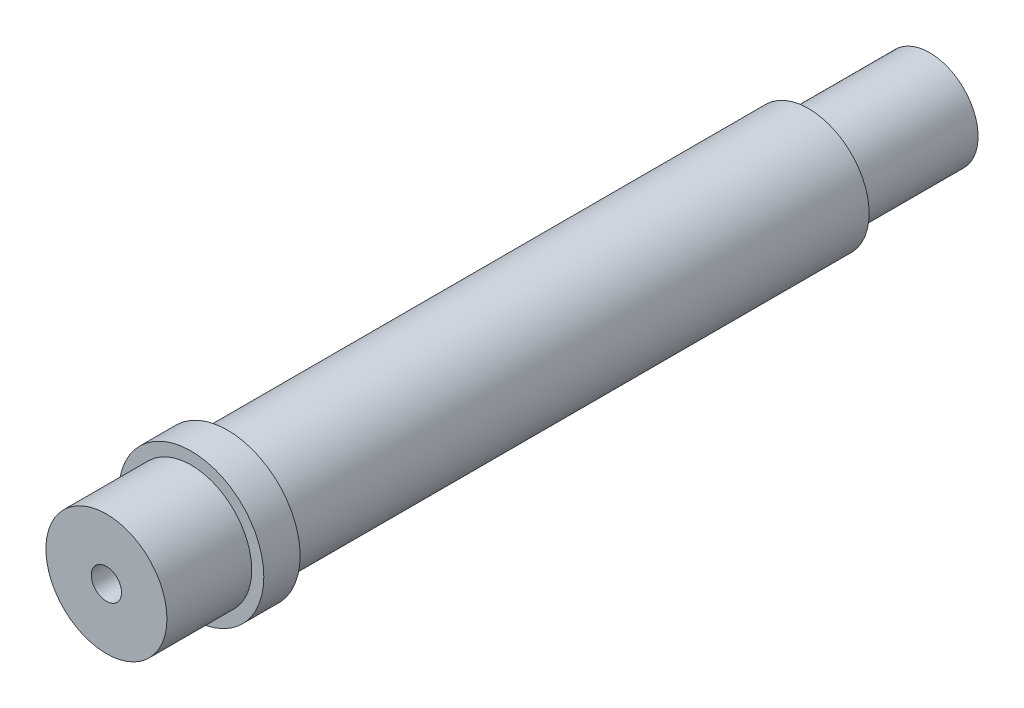
ISO-10303-21;
HEADER;
FILE_DESCRIPTION(('STEP AP214'),'2;1');
FILE_NAME('part.step','',(''),(''),'','','');
FILE_SCHEMA(('AUTOMOTIVE_DESIGN { 1 0 10303 214 1 1 1 1 }'));
ENDSEC;
DATA;
#1=APPLICATION_CONTEXT('core data for automotive mechanical design processes');
#2=APPLICATION_PROTOCOL_DEFINITION('international standard','automotive_design',2000,#1);
#3=PRODUCT_CONTEXT('',#1,'mechanical');
#4=PRODUCT('Part','Part','',(#3));
#5=PRODUCT_RELATED_PRODUCT_CATEGORY('part','',(#4));
#6=PRODUCT_DEFINITION_FORMATION('','',#4);
#7=PRODUCT_DEFINITION_CONTEXT('part definition',#1,'design');
#8=PRODUCT_DEFINITION('design','',#6,#7);
#9=PRODUCT_DEFINITION_SHAPE('','',#8);
#10=(LENGTH_UNIT() NAMED_UNIT(*) SI_UNIT(.MILLI.,.METRE.));
#11=(NAMED_UNIT(*) PLANE_ANGLE_UNIT() SI_UNIT($,.RADIAN.));
#12=(NAMED_UNIT(*) SI_UNIT($,.STERADIAN.) SOLID_ANGLE_UNIT());
#13=UNCERTAINTY_MEASURE_WITH_UNIT(LENGTH_MEASURE(1.E-05),#10,'distance_accuracy_value','');
#14=(GEOMETRIC_REPRESENTATION_CONTEXT(3) GLOBAL_UNCERTAINTY_ASSIGNED_CONTEXT((#13)) GLOBAL_UNIT_ASSIGNED_CONTEXT((#10,
#11,#12)) REPRESENTATION_CONTEXT('',''));
#15=CARTESIAN_POINT('',(0.,0.,0.));
#16=DIRECTION('',(0.,0.,1.));
#17=DIRECTION('',(1.,0.,0.));
#18=AXIS2_PLACEMENT_3D('',#15,#16,#17);
#19=CARTESIAN_POINT('',(0.,0.,48.));
#20=DIRECTION('',(0.,0.,-1.));
#21=DIRECTION('',(-1.,0.,0.));
#22=AXIS2_PLACEMENT_3D('',#19,#20,#21);
#23=CYLINDRICAL_SURFACE('',#22,5.);
#24=CARTESIAN_POINT('',(0.,0.,48.));
#25=DIRECTION('',(0.,0.,1.));
#26=DIRECTION('',(1.,0.,0.));
#27=AXIS2_PLACEMENT_3D('',#24,#25,#26);
#28=CIRCLE('',#27,5.);
#29=CARTESIAN_POINT('',(5.,0.,48.));
#30=VERTEX_POINT('',#29);
#31=EDGE_CURVE('E48',#30,#30,#28,.T.);
#32=ORIENTED_EDGE('',*,*,#31,.F.);
#33=EDGE_LOOP('',(#32));
#34=FACE_BOUND('',#33,.T.);
#35=CARTESIAN_POINT('',(0.,0.,0.));
#36=DIRECTION('',(0.,0.,1.));
#37=DIRECTION('',(1.,0.,0.));
#38=AXIS2_PLACEMENT_3D('',#35,#36,#37);
#39=CIRCLE('',#38,5.);
#40=CARTESIAN_POINT('',(5.,0.,0.));
#41=VERTEX_POINT('',#40);
#42=EDGE_CURVE('E39',#41,#41,#39,.T.);
#43=ORIENTED_EDGE('',*,*,#42,.T.);
#44=EDGE_LOOP('',(#43));
#45=FACE_BOUND('',#44,.T.);
#46=ADVANCED_FACE('F36',(#34,#45),#23,.T.);
#47=CARTESIAN_POINT('',(0.,0.,0.));
#48=DIRECTION('',(0.,0.,1.));
#49=DIRECTION('',(1.,0.,0.));
#50=AXIS2_PLACEMENT_3D('',#47,#48,#49);
#51=PLANE('',#50);
#52=CARTESIAN_POINT('',(0.,0.,0.));
#53=DIRECTION('',(0.,0.,-1.));
#54=DIRECTION('',(-1.,0.,0.));
#55=AXIS2_PLACEMENT_3D('',#52,#53,#54);
#56=CIRCLE('',#55,4.);
#57=CARTESIAN_POINT('',(-4.,0.,0.));
#58=VERTEX_POINT('',#57);
#59=EDGE_CURVE('E10',#58,#58,#56,.T.);
#60=ORIENTED_EDGE('',*,*,#59,.F.);
#61=EDGE_LOOP('',(#60));
#62=FACE_BOUND('',#61,.T.);
#63=ORIENTED_EDGE('',*,*,#42,.F.);
#64=EDGE_LOOP('',(#63));
#65=FACE_BOUND('',#64,.T.);
#66=ADVANCED_FACE('F69',(#62,#65),#51,.F.);
#67=CARTESIAN_POINT('',(0.,0.,51.));
#68=DIRECTION('',(0.,0.,-1.));
#69=DIRECTION('',(-1.,0.,0.));
#70=AXIS2_PLACEMENT_3D('',#67,#68,#69);
#71=CYLINDRICAL_SURFACE('',#70,6.);
#72=CARTESIAN_POINT('',(0.,0.,51.));
#73=DIRECTION('',(0.,0.,1.));
#74=DIRECTION('',(1.,0.,0.));
#75=AXIS2_PLACEMENT_3D('',#72,#73,#74);
#76=CIRCLE('',#75,6.);
#77=CARTESIAN_POINT('',(6.,0.,51.));
#78=VERTEX_POINT('',#77);
#79=EDGE_CURVE('E58',#78,#78,#76,.T.);
#80=ORIENTED_EDGE('',*,*,#79,.F.);
#81=EDGE_LOOP('',(#80));
#82=FACE_BOUND('',#81,.T.);
#83=CARTESIAN_POINT('',(0.,0.,48.));
#84=DIRECTION('',(0.,0.,1.));
#85=DIRECTION('',(1.,0.,0.));
#86=AXIS2_PLACEMENT_3D('',#83,#84,#85);
#87=CIRCLE('',#86,6.);
#88=CARTESIAN_POINT('',(6.,0.,48.));
#89=VERTEX_POINT('',#88);
#90=EDGE_CURVE('E56',#89,#89,#87,.T.);
#91=ORIENTED_EDGE('',*,*,#90,.T.);
#92=EDGE_LOOP('',(#91));
#93=FACE_BOUND('',#92,.T.);
#94=ADVANCED_FACE('F71',(#82,#93),#71,.T.);
#95=CARTESIAN_POINT('',(0.,0.,51.));
#96=DIRECTION('',(0.,0.,1.));
#97=DIRECTION('',(1.,0.,0.));
#98=AXIS2_PLACEMENT_3D('',#95,#96,#97);
#99=PLANE('',#98);
#100=CARTESIAN_POINT('',(0.,0.,51.));
#101=DIRECTION('',(0.,0.,1.));
#102=DIRECTION('',(1.,0.,0.));
#103=AXIS2_PLACEMENT_3D('',#100,#101,#102);
#104=CIRCLE('',#103,5.);
#105=CARTESIAN_POINT('',(5.,0.,51.));
#106=VERTEX_POINT('',#105);
#107=EDGE_CURVE('E43',#106,#106,#104,.T.);
#108=ORIENTED_EDGE('',*,*,#107,.F.);
#109=EDGE_LOOP('',(#108));
#110=FACE_BOUND('',#109,.T.);
#111=ORIENTED_EDGE('',*,*,#79,.T.);
#112=EDGE_LOOP('',(#111));
#113=FACE_BOUND('',#112,.T.);
#114=ADVANCED_FACE('F77',(#110,#113),#99,.T.);
#115=CARTESIAN_POINT('',(0.,0.,48.));
#116=DIRECTION('',(0.,0.,1.));
#117=DIRECTION('',(1.,0.,0.));
#118=AXIS2_PLACEMENT_3D('',#115,#116,#117);
#119=PLANE('',#118);
#120=ORIENTED_EDGE('',*,*,#31,.T.);
#121=EDGE_LOOP('',(#120));
#122=FACE_BOUND('',#121,.T.);
#123=ORIENTED_EDGE('',*,*,#90,.F.);
#124=EDGE_LOOP('',(#123));
#125=FACE_BOUND('',#124,.T.);
#126=ADVANCED_FACE('F82',(#122,#125),#119,.F.);
#127=CARTESIAN_POINT('',(0.,0.,58.));
#128=DIRECTION('',(0.,0.,-1.));
#129=DIRECTION('',(-1.,0.,0.));
#130=AXIS2_PLACEMENT_3D('',#127,#128,#129);
#131=CYLINDRICAL_SURFACE('',#130,5.);
#132=CARTESIAN_POINT('',(0.,0.,58.));
#133=DIRECTION('',(0.,0.,1.));
#134=DIRECTION('',(1.,0.,0.));
#135=AXIS2_PLACEMENT_3D('',#132,#133,#134);
#136=CIRCLE('',#135,5.);
#137=CARTESIAN_POINT('',(5.,0.,58.));
#138=VERTEX_POINT('',#137);
#139=EDGE_CURVE('E54',#138,#138,#136,.T.);
#140=ORIENTED_EDGE('',*,*,#139,.F.);
#141=EDGE_LOOP('',(#140));
#142=FACE_BOUND('',#141,.T.);
#143=ORIENTED_EDGE('',*,*,#107,.T.);
#144=EDGE_LOOP('',(#143));
#145=FACE_BOUND('',#144,.T.);
#146=ADVANCED_FACE('F85',(#142,#145),#131,.T.);
#147=CARTESIAN_POINT('',(0.,0.,58.));
#148=DIRECTION('',(0.,0.,1.));
#149=DIRECTION('',(1.,0.,0.));
#150=AXIS2_PLACEMENT_3D('',#147,#148,#149);
#151=PLANE('',#150);
#152=CARTESIAN_POINT('',(0.,0.,58.));
#153=DIRECTION('',(0.,0.,1.));
#154=DIRECTION('',(1.,0.,0.));
#155=AXIS2_PLACEMENT_3D('',#152,#153,#154);
#156=CIRCLE('',#155,1.25);
#157=CARTESIAN_POINT('',(1.25,0.,58.));
#158=VERTEX_POINT('',#157);
#159=EDGE_CURVE('E124',#158,#158,#156,.T.);
#160=ORIENTED_EDGE('',*,*,#159,.F.);
#161=EDGE_LOOP('',(#160));
#162=FACE_BOUND('',#161,.T.);
#163=ORIENTED_EDGE('',*,*,#139,.T.);
#164=EDGE_LOOP('',(#163));
#165=FACE_BOUND('',#164,.T.);
#166=ADVANCED_FACE('F91',(#162,#165),#151,.T.);
#167=CARTESIAN_POINT('',(0.,0.,-10.));
#168=DIRECTION('',(0.,0.,1.));
#169=DIRECTION('',(1.,0.,0.));
#170=AXIS2_PLACEMENT_3D('',#167,#168,#169);
#171=CYLINDRICAL_SURFACE('',#170,4.);
#172=CARTESIAN_POINT('',(0.,0.,-10.));
#173=DIRECTION('',(0.,0.,-1.));
#174=DIRECTION('',(-1.,0.,0.));
#175=AXIS2_PLACEMENT_3D('',#172,#173,#174);
#176=CIRCLE('',#175,4.);
#177=CARTESIAN_POINT('',(-4.,0.,-10.));
#178=VERTEX_POINT('',#177);
#179=EDGE_CURVE('E52',#178,#178,#176,.T.);
#180=ORIENTED_EDGE('',*,*,#179,.F.);
#181=EDGE_LOOP('',(#180));
#182=FACE_BOUND('',#181,.T.);
#183=ORIENTED_EDGE('',*,*,#59,.T.);
#184=EDGE_LOOP('',(#183));
#185=FACE_BOUND('',#184,.T.);
#186=ADVANCED_FACE('F95',(#182,#185),#171,.T.);
#187=CARTESIAN_POINT('',(0.,0.,-10.));
#188=DIRECTION('',(0.,0.,-1.));
#189=DIRECTION('',(-1.,0.,0.));
#190=AXIS2_PLACEMENT_3D('',#187,#188,#189);
#191=PLANE('',#190);
#192=CARTESIAN_POINT('',(0.,0.,-10.));
#193=DIRECTION('',(0.,0.,-1.));
#194=DIRECTION('',(-1.,0.,0.));
#195=AXIS2_PLACEMENT_3D('',#192,#193,#194);
#196=CIRCLE('',#195,1.25);
#197=CARTESIAN_POINT('',(-1.25,0.,-10.));
#198=VERTEX_POINT('',#197);
#199=EDGE_CURVE('E125',#198,#198,#196,.T.);
#200=ORIENTED_EDGE('',*,*,#199,.F.);
#201=EDGE_LOOP('',(#200));
#202=FACE_BOUND('',#201,.T.);
#203=ORIENTED_EDGE('',*,*,#179,.T.);
#204=EDGE_LOOP('',(#203));
#205=FACE_BOUND('',#204,.T.);
#206=ADVANCED_FACE('F99',(#202,#205),#191,.T.);
#207=CARTESIAN_POINT('',(0.,0.,48.));
#208=DIRECTION('',(0.,0.,1.));
#209=DIRECTION('',(1.,0.,0.));
#210=AXIS2_PLACEMENT_3D('',#207,#208,#209);
#211=CYLINDRICAL_SURFACE('',#210,1.25);
#212=CARTESIAN_POINT('',(0.,0.,48.));
#213=DIRECTION('',(0.,0.,1.));
#214=DIRECTION('',(1.,0.,0.));
#215=AXIS2_PLACEMENT_3D('',#212,#213,#214);
#216=CIRCLE('',#215,1.25);
#217=CARTESIAN_POINT('',(1.25,0.,48.));
#218=VERTEX_POINT('',#217);
#219=EDGE_CURVE('E128',#218,#218,#216,.T.);
#220=ORIENTED_EDGE('',*,*,#219,.F.);
#221=EDGE_LOOP('',(#220));
#222=FACE_BOUND('',#221,.T.);
#223=ORIENTED_EDGE('',*,*,#159,.T.);
#224=EDGE_LOOP('',(#223));
#225=FACE_BOUND('',#224,.T.);
#226=ADVANCED_FACE('F103',(#222,#225),#211,.F.);
#227=CARTESIAN_POINT('',(0.,0.,48.));
#228=DIRECTION('',(0.,0.,1.));
#229=DIRECTION('',(1.,0.,0.));
#230=AXIS2_PLACEMENT_3D('',#227,#228,#229);
#231=PLANE('',#230);
#232=ORIENTED_EDGE('',*,*,#219,.T.);
#233=EDGE_LOOP('',(#232));
#234=FACE_BOUND('',#233,.T.);
#235=ADVANCED_FACE('F107',(#234),#231,.T.);
#236=CARTESIAN_POINT('',(0.,0.,0.));
#237=DIRECTION('',(0.,0.,-1.));
#238=DIRECTION('',(-1.,0.,0.));
#239=AXIS2_PLACEMENT_3D('',#236,#237,#238);
#240=CYLINDRICAL_SURFACE('',#239,1.25);
#241=CARTESIAN_POINT('',(0.,0.,0.));
#242=DIRECTION('',(0.,0.,-1.));
#243=DIRECTION('',(-1.,0.,0.));
#244=AXIS2_PLACEMENT_3D('',#241,#242,#243);
#245=CIRCLE('',#244,1.25);
#246=CARTESIAN_POINT('',(-1.25,0.,0.));
#247=VERTEX_POINT('',#246);
#248=EDGE_CURVE('E123',#247,#247,#245,.T.);
#249=ORIENTED_EDGE('',*,*,#248,.F.);
#250=EDGE_LOOP('',(#249));
#251=FACE_BOUND('',#250,.T.);
#252=ORIENTED_EDGE('',*,*,#199,.T.);
#253=EDGE_LOOP('',(#252));
#254=FACE_BOUND('',#253,.T.);
#255=ADVANCED_FACE('F111',(#251,#254),#240,.F.);
#256=CARTESIAN_POINT('',(0.,0.,0.));
#257=DIRECTION('',(0.,0.,-1.));
#258=DIRECTION('',(-1.,0.,0.));
#259=AXIS2_PLACEMENT_3D('',#256,#257,#258);
#260=PLANE('',#259);
#261=ORIENTED_EDGE('',*,*,#248,.T.);
#262=EDGE_LOOP('',(#261));
#263=FACE_BOUND('',#262,.T.);
#264=ADVANCED_FACE('F115',(#263),#260,.T.);
#265=CLOSED_SHELL('',(#46,#66,#94,#114,#126,#146,#166,#186,#206,#226,#235,#255,#264));
#266=MANIFOLD_SOLID_BREP('B2',#265);
#267=ADVANCED_BREP_SHAPE_REPRESENTATION('',(#18,#266),#14);
#268=SHAPE_DEFINITION_REPRESENTATION(#9,#267);
ENDSEC;
END-ISO-10303-21;
